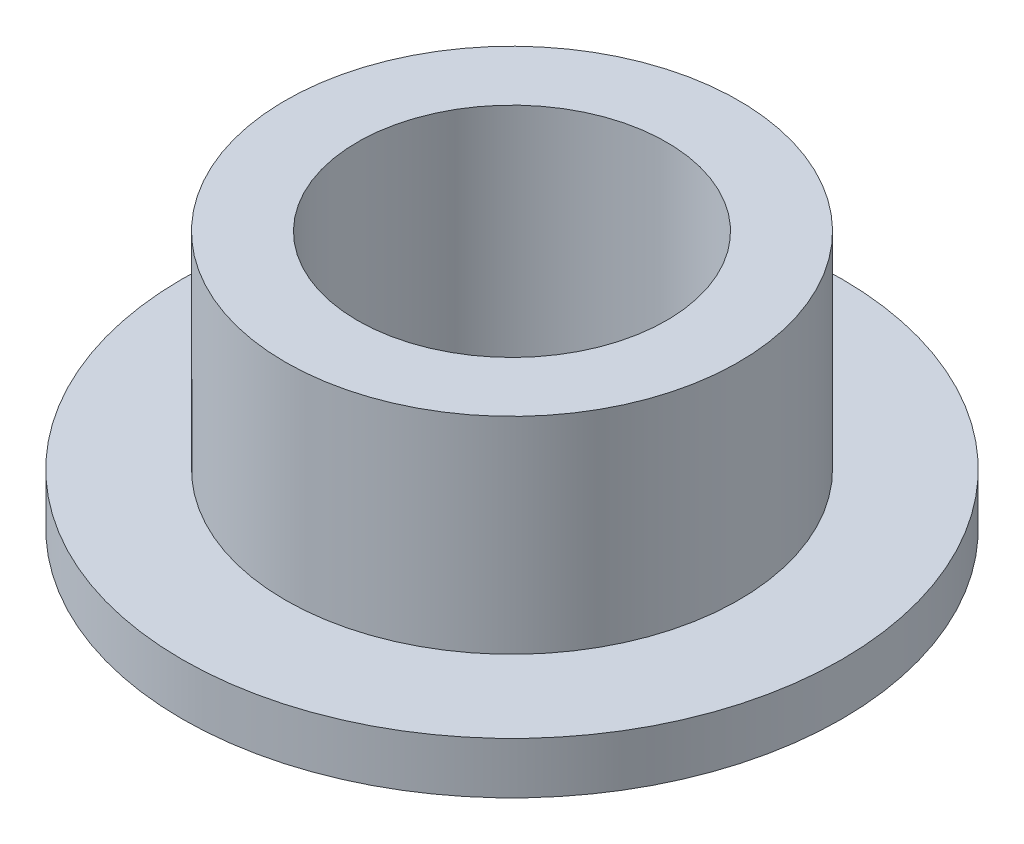
ISO-10303-21;
HEADER;
FILE_DESCRIPTION(('STEP AP214'),'2;1');
FILE_NAME('part.step','',(''),(''),'','','');
FILE_SCHEMA(('AUTOMOTIVE_DESIGN { 1 0 10303 214 1 1 1 1 }'));
ENDSEC;
DATA;
#1=APPLICATION_CONTEXT('core data for automotive mechanical design processes');
#2=APPLICATION_PROTOCOL_DEFINITION('international standard','automotive_design',2000,#1);
#3=PRODUCT_CONTEXT('',#1,'mechanical');
#4=PRODUCT('Part','Part','',(#3));
#5=PRODUCT_RELATED_PRODUCT_CATEGORY('part','',(#4));
#6=PRODUCT_DEFINITION_FORMATION('','',#4);
#7=PRODUCT_DEFINITION_CONTEXT('part definition',#1,'design');
#8=PRODUCT_DEFINITION('design','',#6,#7);
#9=PRODUCT_DEFINITION_SHAPE('','',#8);
#10=(LENGTH_UNIT() NAMED_UNIT(*) SI_UNIT(.MILLI.,.METRE.));
#11=(NAMED_UNIT(*) PLANE_ANGLE_UNIT() SI_UNIT($,.RADIAN.));
#12=(NAMED_UNIT(*) SI_UNIT($,.STERADIAN.) SOLID_ANGLE_UNIT());
#13=UNCERTAINTY_MEASURE_WITH_UNIT(LENGTH_MEASURE(1.E-05),#10,'distance_accuracy_value','');
#14=(GEOMETRIC_REPRESENTATION_CONTEXT(3) GLOBAL_UNCERTAINTY_ASSIGNED_CONTEXT((#13)) GLOBAL_UNIT_ASSIGNED_CONTEXT((#10,
#11,#12)) REPRESENTATION_CONTEXT('',''));
#15=CARTESIAN_POINT('',(0.,0.,0.));
#16=DIRECTION('',(0.,0.,1.));
#17=DIRECTION('',(1.,0.,0.));
#18=AXIS2_PLACEMENT_3D('',#15,#16,#17);
#19=CARTESIAN_POINT('',(0.,2.5,0.));
#20=DIRECTION('',(0.,1.,0.));
#21=DIRECTION('',(0.,0.,1.));
#22=AXIS2_PLACEMENT_3D('',#19,#20,#21);
#23=PLANE('',#22);
#24=CARTESIAN_POINT('',(0.,2.5,0.));
#25=DIRECTION('',(0.,1.,0.));
#26=DIRECTION('',(0.,0.,1.));
#27=AXIS2_PLACEMENT_3D('',#24,#25,#26);
#28=CIRCLE('',#27,16.);
#29=CARTESIAN_POINT('',(0.,2.5,16.));
#30=VERTEX_POINT('',#29);
#31=EDGE_CURVE('E10',#30,#30,#28,.T.);
#32=ORIENTED_EDGE('',*,*,#31,.T.);
#33=EDGE_LOOP('',(#32));
#34=FACE_BOUND('',#33,.T.);
#35=CARTESIAN_POINT('',(0.,2.5,0.));
#36=DIRECTION('',(0.,1.,0.));
#37=DIRECTION('',(0.,0.,1.));
#38=AXIS2_PLACEMENT_3D('',#35,#36,#37);
#39=CIRCLE('',#38,11.);
#40=CARTESIAN_POINT('',(0.,2.5,11.));
#41=VERTEX_POINT('',#40);
#42=EDGE_CURVE('E56',#41,#41,#39,.T.);
#43=ORIENTED_EDGE('',*,*,#42,.F.);
#44=EDGE_LOOP('',(#43));
#45=FACE_BOUND('',#44,.T.);
#46=ADVANCED_FACE('F37',(#34,#45),#23,.T.);
#47=CARTESIAN_POINT('',(0.,0.,0.));
#48=DIRECTION('',(0.,1.,0.));
#49=DIRECTION('',(0.,0.,1.));
#50=AXIS2_PLACEMENT_3D('',#47,#48,#49);
#51=PLANE('',#50);
#52=CARTESIAN_POINT('',(0.,0.,0.));
#53=DIRECTION('',(0.,1.,0.));
#54=DIRECTION('',(0.,0.,1.));
#55=AXIS2_PLACEMENT_3D('',#52,#53,#54);
#56=CIRCLE('',#55,16.);
#57=CARTESIAN_POINT('',(0.,0.,16.));
#58=VERTEX_POINT('',#57);
#59=EDGE_CURVE('E41',#58,#58,#56,.T.);
#60=ORIENTED_EDGE('',*,*,#59,.F.);
#61=EDGE_LOOP('',(#60));
#62=FACE_BOUND('',#61,.T.);
#63=CARTESIAN_POINT('',(0.,0.,0.));
#64=DIRECTION('',(0.,1.,0.));
#65=DIRECTION('',(0.,0.,1.));
#66=AXIS2_PLACEMENT_3D('',#63,#64,#65);
#67=CIRCLE('',#66,7.5);
#68=CARTESIAN_POINT('',(0.,0.,7.5));
#69=VERTEX_POINT('',#68);
#70=EDGE_CURVE('E50',#69,#69,#67,.T.);
#71=ORIENTED_EDGE('',*,*,#70,.T.);
#72=EDGE_LOOP('',(#71));
#73=FACE_BOUND('',#72,.T.);
#74=ADVANCED_FACE('F84',(#62,#73),#51,.F.);
#75=CARTESIAN_POINT('',(0.,2.5,0.));
#76=DIRECTION('',(0.,-1.,0.));
#77=DIRECTION('',(0.,0.,-1.));
#78=AXIS2_PLACEMENT_3D('',#75,#76,#77);
#79=CYLINDRICAL_SURFACE('',#78,16.);
#80=ORIENTED_EDGE('',*,*,#31,.F.);
#81=EDGE_LOOP('',(#80));
#82=FACE_BOUND('',#81,.T.);
#83=ORIENTED_EDGE('',*,*,#59,.T.);
#84=EDGE_LOOP('',(#83));
#85=FACE_BOUND('',#84,.T.);
#86=ADVANCED_FACE('F39',(#82,#85),#79,.T.);
#87=CARTESIAN_POINT('',(0.,2.5,0.));
#88=DIRECTION('',(0.,-1.,0.));
#89=DIRECTION('',(0.,0.,-1.));
#90=AXIS2_PLACEMENT_3D('',#87,#88,#89);
#91=CYLINDRICAL_SURFACE('',#90,7.5);
#92=ORIENTED_EDGE('',*,*,#70,.F.);
#93=EDGE_LOOP('',(#92));
#94=FACE_BOUND('',#93,.T.);
#95=CARTESIAN_POINT('',(0.,12.5,0.));
#96=DIRECTION('',(0.,1.,0.));
#97=DIRECTION('',(0.,0.,1.));
#98=AXIS2_PLACEMENT_3D('',#95,#96,#97);
#99=CIRCLE('',#98,7.5);
#100=CARTESIAN_POINT('',(0.,12.5,7.5));
#101=VERTEX_POINT('',#100);
#102=EDGE_CURVE('E60',#101,#101,#99,.T.);
#103=ORIENTED_EDGE('',*,*,#102,.T.);
#104=EDGE_LOOP('',(#103));
#105=FACE_BOUND('',#104,.T.);
#106=ADVANCED_FACE('F68',(#94,#105),#91,.F.);
#107=CARTESIAN_POINT('',(0.,12.5,0.));
#108=DIRECTION('',(0.,1.,0.));
#109=DIRECTION('',(0.,0.,1.));
#110=AXIS2_PLACEMENT_3D('',#107,#108,#109);
#111=PLANE('',#110);
#112=CARTESIAN_POINT('',(0.,12.5,0.));
#113=DIRECTION('',(0.,1.,0.));
#114=DIRECTION('',(0.,0.,1.));
#115=AXIS2_PLACEMENT_3D('',#112,#113,#114);
#116=CIRCLE('',#115,11.);
#117=CARTESIAN_POINT('',(0.,12.5,11.));
#118=VERTEX_POINT('',#117);
#119=EDGE_CURVE('E55',#118,#118,#116,.T.);
#120=ORIENTED_EDGE('',*,*,#119,.T.);
#121=EDGE_LOOP('',(#120));
#122=FACE_BOUND('',#121,.T.);
#123=ORIENTED_EDGE('',*,*,#102,.F.);
#124=EDGE_LOOP('',(#123));
#125=FACE_BOUND('',#124,.T.);
#126=ADVANCED_FACE('F70',(#122,#125),#111,.T.);
#127=CARTESIAN_POINT('',(0.,12.5,0.));
#128=DIRECTION('',(0.,-1.,0.));
#129=DIRECTION('',(0.,0.,-1.));
#130=AXIS2_PLACEMENT_3D('',#127,#128,#129);
#131=CYLINDRICAL_SURFACE('',#130,11.);
#132=ORIENTED_EDGE('',*,*,#119,.F.);
#133=EDGE_LOOP('',(#132));
#134=FACE_BOUND('',#133,.T.);
#135=ORIENTED_EDGE('',*,*,#42,.T.);
#136=EDGE_LOOP('',(#135));
#137=FACE_BOUND('',#136,.T.);
#138=ADVANCED_FACE('F72',(#134,#137),#131,.T.);
#139=CLOSED_SHELL('',(#46,#74,#86,#106,#126,#138));
#140=MANIFOLD_SOLID_BREP('B2',#139);
#141=ADVANCED_BREP_SHAPE_REPRESENTATION('',(#18,#140),#14);
#142=SHAPE_DEFINITION_REPRESENTATION(#9,#141);
ENDSEC;
END-ISO-10303-21;
